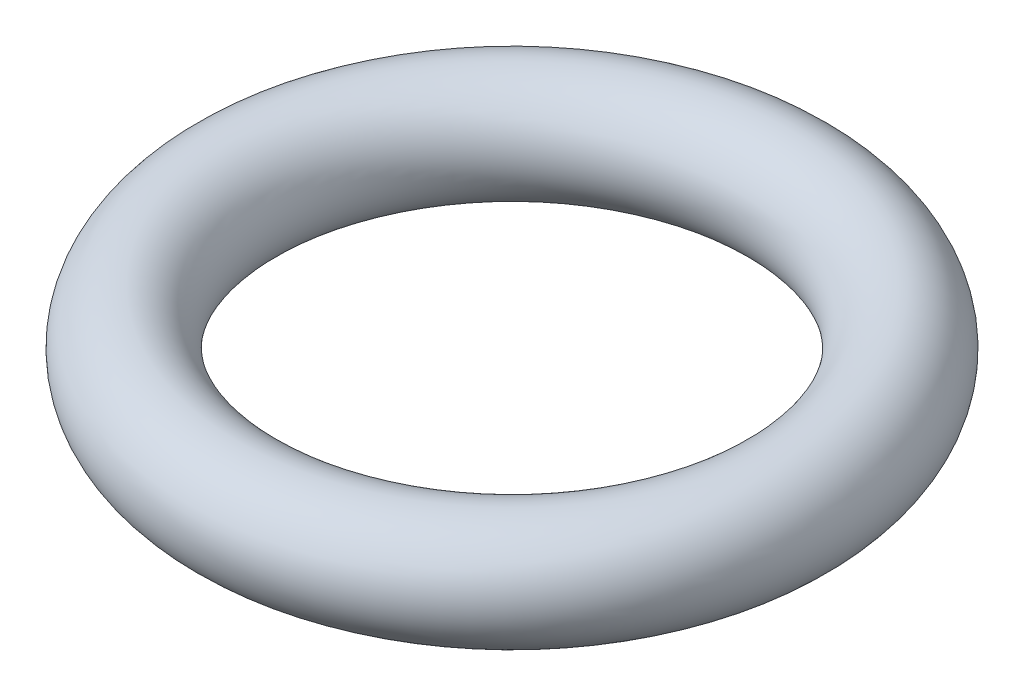
ISO-10303-21;
HEADER;
FILE_DESCRIPTION(('STEP AP214'),'2;1');
FILE_NAME('part.step','',(''),(''),'','','');
FILE_SCHEMA(('AUTOMOTIVE_DESIGN { 1 0 10303 214 1 1 1 1 }'));
ENDSEC;
DATA;
#1=APPLICATION_CONTEXT('core data for automotive mechanical design processes');
#2=APPLICATION_PROTOCOL_DEFINITION('international standard','automotive_design',2000,#1);
#3=PRODUCT_CONTEXT('',#1,'mechanical');
#4=PRODUCT('Part','Part','',(#3));
#5=PRODUCT_RELATED_PRODUCT_CATEGORY('part','',(#4));
#6=PRODUCT_DEFINITION_FORMATION('','',#4);
#7=PRODUCT_DEFINITION_CONTEXT('part definition',#1,'design');
#8=PRODUCT_DEFINITION('design','',#6,#7);
#9=PRODUCT_DEFINITION_SHAPE('','',#8);
#10=(LENGTH_UNIT() NAMED_UNIT(*) SI_UNIT(.MILLI.,.METRE.));
#11=(NAMED_UNIT(*) PLANE_ANGLE_UNIT() SI_UNIT($,.RADIAN.));
#12=(NAMED_UNIT(*) SI_UNIT($,.STERADIAN.) SOLID_ANGLE_UNIT());
#13=UNCERTAINTY_MEASURE_WITH_UNIT(LENGTH_MEASURE(1.E-05),#10,'distance_accuracy_value','');
#14=(GEOMETRIC_REPRESENTATION_CONTEXT(3) GLOBAL_UNCERTAINTY_ASSIGNED_CONTEXT((#13)) GLOBAL_UNIT_ASSIGNED_CONTEXT((#10,
#11,#12)) REPRESENTATION_CONTEXT('',''));
#15=CARTESIAN_POINT('',(0.,0.,0.));
#16=DIRECTION('',(0.,0.,1.));
#17=DIRECTION('',(1.,0.,0.));
#18=AXIS2_PLACEMENT_3D('',#15,#16,#17);
#19=CARTESIAN_POINT('',(0.,0.,0.));
#20=DIRECTION('',(0.,1.,0.));
#21=DIRECTION('',(0.,0.,1.));
#22=AXIS2_PLACEMENT_3D('',#19,#20,#21);
#23=TOROIDAL_SURFACE('',#22,5.,1.);
#24=CARTESIAN_POINT('',(0.,0.,6.));
#25=VERTEX_POINT('',#24);
#26=VERTEX_LOOP('',#25);
#27=FACE_BOUND('',#26,.T.);
#28=ADVANCED_FACE('F29',(#27),#23,.T.);
#29=CLOSED_SHELL('',(#28));
#30=MANIFOLD_SOLID_BREP('B2',#29);
#31=ADVANCED_BREP_SHAPE_REPRESENTATION('',(#18,#30),#14);
#32=SHAPE_DEFINITION_REPRESENTATION(#9,#31);
ENDSEC;
END-ISO-10303-21;
